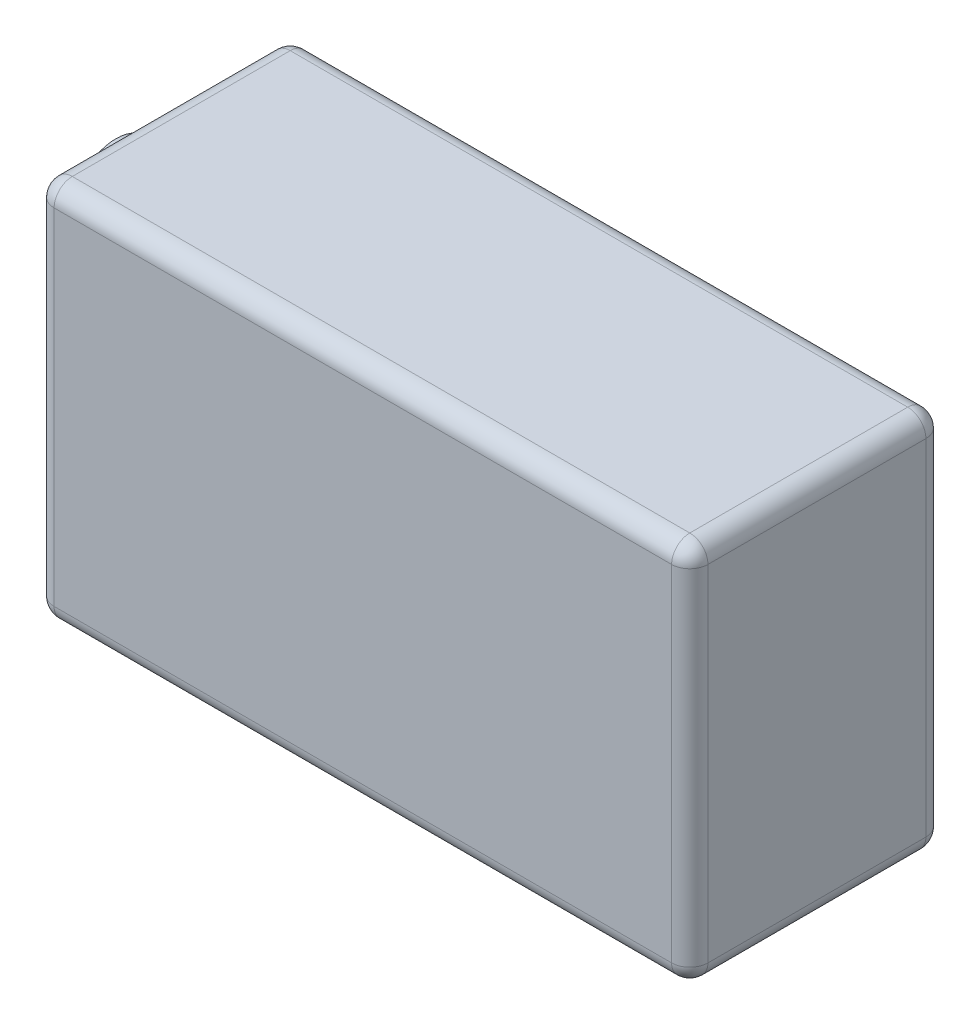
ISO-10303-21;
HEADER;
FILE_DESCRIPTION(('STEP AP214'),'2;1');
FILE_NAME('part.step','',(''),(''),'','','');
FILE_SCHEMA(('AUTOMOTIVE_DESIGN { 1 0 10303 214 1 1 1 1 }'));
ENDSEC;
DATA;
#1=APPLICATION_CONTEXT('core data for automotive mechanical design processes');
#2=APPLICATION_PROTOCOL_DEFINITION('international standard','automotive_design',2000,#1);
#3=PRODUCT_CONTEXT('',#1,'mechanical');
#4=PRODUCT('Part','Part','',(#3));
#5=PRODUCT_RELATED_PRODUCT_CATEGORY('part','',(#4));
#6=PRODUCT_DEFINITION_FORMATION('','',#4);
#7=PRODUCT_DEFINITION_CONTEXT('part definition',#1,'design');
#8=PRODUCT_DEFINITION('design','',#6,#7);
#9=PRODUCT_DEFINITION_SHAPE('','',#8);
#10=(LENGTH_UNIT() NAMED_UNIT(*) SI_UNIT(.MILLI.,.METRE.));
#11=(NAMED_UNIT(*) PLANE_ANGLE_UNIT() SI_UNIT($,.RADIAN.));
#12=(NAMED_UNIT(*) SI_UNIT($,.STERADIAN.) SOLID_ANGLE_UNIT());
#13=UNCERTAINTY_MEASURE_WITH_UNIT(LENGTH_MEASURE(1.E-05),#10,'distance_accuracy_value','');
#14=(GEOMETRIC_REPRESENTATION_CONTEXT(3) GLOBAL_UNCERTAINTY_ASSIGNED_CONTEXT((#13)) GLOBAL_UNIT_ASSIGNED_CONTEXT((#10,
#11,#12)) REPRESENTATION_CONTEXT('',''));
#15=CARTESIAN_POINT('',(0.,0.,0.));
#16=DIRECTION('',(0.,0.,1.));
#17=DIRECTION('',(1.,0.,0.));
#18=AXIS2_PLACEMENT_3D('',#15,#16,#17);
#19=CARTESIAN_POINT('',(22.86,13.335,17.78));
#20=DIRECTION('',(-1.,0.,0.));
#21=DIRECTION('',(0.,0.,1.));
#22=AXIS2_PLACEMENT_3D('',#19,#20,#21);
#23=PLANE('',#22);
#24=DIRECTION('',(0.,1.,0.));
#25=VECTOR('',#24,1.);
#26=CARTESIAN_POINT('',(22.86,13.335,1.27));
#27=LINE('',#26,#25);
#28=CARTESIAN_POINT('',(22.86,-12.065,1.27));
#29=VERTEX_POINT('',#28);
#30=CARTESIAN_POINT('',(22.86,12.065,1.27));
#31=VERTEX_POINT('',#30);
#32=EDGE_CURVE('E47',#29,#31,#27,.T.);
#33=ORIENTED_EDGE('',*,*,#32,.T.);
#34=DIRECTION('',(0.,0.,-1.));
#35=VECTOR('',#34,1.);
#36=CARTESIAN_POINT('',(22.86,12.065,17.78));
#37=LINE('',#36,#35);
#38=CARTESIAN_POINT('',(22.86,12.065,16.51));
#39=VERTEX_POINT('',#38);
#40=EDGE_CURVE('E205',#31,#39,#37,.F.);
#41=ORIENTED_EDGE('',*,*,#40,.T.);
#42=DIRECTION('',(0.,1.,0.));
#43=VECTOR('',#42,1.);
#44=CARTESIAN_POINT('',(22.86,-13.335,16.51));
#45=LINE('',#44,#43);
#46=CARTESIAN_POINT('',(22.86,-12.065,16.51));
#47=VERTEX_POINT('',#46);
#48=EDGE_CURVE('E137',#39,#47,#45,.F.);
#49=ORIENTED_EDGE('',*,*,#48,.T.);
#50=DIRECTION('',(0.,0.,-1.));
#51=VECTOR('',#50,1.);
#52=CARTESIAN_POINT('',(22.86,-12.065,17.78));
#53=LINE('',#52,#51);
#54=EDGE_CURVE('E52',#47,#29,#53,.T.);
#55=ORIENTED_EDGE('',*,*,#54,.T.);
#56=EDGE_LOOP('',(#33,#41,#49,#55));
#57=FACE_BOUND('',#56,.T.);
#58=ADVANCED_FACE('F32',(#57),#23,.F.);
#59=CARTESIAN_POINT('',(-22.86,13.335,17.78));
#60=DIRECTION('',(0.,-1.,0.));
#61=DIRECTION('',(0.,0.,-1.));
#62=AXIS2_PLACEMENT_3D('',#59,#60,#61);
#63=PLANE('',#62);
#64=DIRECTION('',(0.,0.,-1.));
#65=VECTOR('',#64,1.);
#66=CARTESIAN_POINT('',(21.59,13.335,17.78));
#67=LINE('',#66,#65);
#68=CARTESIAN_POINT('',(21.59,13.335,16.51));
#69=VERTEX_POINT('',#68);
#70=CARTESIAN_POINT('',(21.59,13.335,1.27));
#71=VERTEX_POINT('',#70);
#72=EDGE_CURVE('E195',#69,#71,#67,.T.);
#73=ORIENTED_EDGE('',*,*,#72,.T.);
#74=DIRECTION('',(-1.,0.,0.));
#75=VECTOR('',#74,1.);
#76=CARTESIAN_POINT('',(-22.86,13.335,1.27));
#77=LINE('',#76,#75);
#78=CARTESIAN_POINT('',(-21.59,13.335,1.27));
#79=VERTEX_POINT('',#78);
#80=EDGE_CURVE('E200',#71,#79,#77,.T.);
#81=ORIENTED_EDGE('',*,*,#80,.T.);
#82=DIRECTION('',(0.,0.,-1.));
#83=VECTOR('',#82,1.);
#84=CARTESIAN_POINT('',(-21.59,13.335,17.78));
#85=LINE('',#84,#83);
#86=CARTESIAN_POINT('',(-21.59,13.335,16.51));
#87=VERTEX_POINT('',#86);
#88=EDGE_CURVE('E197',#79,#87,#85,.F.);
#89=ORIENTED_EDGE('',*,*,#88,.T.);
#90=DIRECTION('',(-1.,0.,0.));
#91=VECTOR('',#90,1.);
#92=CARTESIAN_POINT('',(22.86,13.335,16.51));
#93=LINE('',#92,#91);
#94=EDGE_CURVE('E193',#87,#69,#93,.F.);
#95=ORIENTED_EDGE('',*,*,#94,.T.);
#96=EDGE_LOOP('',(#73,#81,#89,#95));
#97=FACE_BOUND('',#96,.T.);
#98=ADVANCED_FACE('F265',(#97),#63,.F.);
#99=CARTESIAN_POINT('',(-22.86,13.335,17.78));
#100=DIRECTION('',(1.,0.,0.));
#101=DIRECTION('',(0.,1.,0.));
#102=AXIS2_PLACEMENT_3D('',#99,#100,#101);
#103=PLANE('',#102);
#104=CARTESIAN_POINT('',(-22.86,-5.8801,8.89));
#105=DIRECTION('',(1.,0.,0.));
#106=DIRECTION('',(0.,1.,0.));
#107=AXIS2_PLACEMENT_3D('',#104,#105,#106);
#108=CIRCLE('',#107,4.0005);
#109=CARTESIAN_POINT('',(-22.86,-1.8796,8.89));
#110=VERTEX_POINT('',#109);
#111=EDGE_CURVE('E11',#110,#110,#108,.F.);
#112=ORIENTED_EDGE('',*,*,#111,.F.);
#113=EDGE_LOOP('',(#112));
#114=FACE_BOUND('',#113,.T.);
#115=CARTESIAN_POINT('',(-22.86,6.5405,8.89));
#116=DIRECTION('',(1.,0.,0.));
#117=DIRECTION('',(0.,1.,0.));
#118=AXIS2_PLACEMENT_3D('',#115,#116,#117);
#119=CIRCLE('',#118,2.9845);
#120=CARTESIAN_POINT('',(-22.86,9.525,8.89));
#121=VERTEX_POINT('',#120);
#122=EDGE_CURVE('E40',#121,#121,#119,.F.);
#123=ORIENTED_EDGE('',*,*,#122,.F.);
#124=EDGE_LOOP('',(#123));
#125=FACE_BOUND('',#124,.T.);
#126=DIRECTION('',(0.,0.,-1.));
#127=VECTOR('',#126,1.);
#128=CARTESIAN_POINT('',(-22.86,-12.065,17.78));
#129=LINE('',#128,#127);
#130=CARTESIAN_POINT('',(-22.86,-12.065,1.27));
#131=VERTEX_POINT('',#130);
#132=CARTESIAN_POINT('',(-22.86,-12.065,16.51));
#133=VERTEX_POINT('',#132);
#134=EDGE_CURVE('E170',#131,#133,#129,.F.);
#135=ORIENTED_EDGE('',*,*,#134,.T.);
#136=DIRECTION('',(0.,-1.,0.));
#137=VECTOR('',#136,1.);
#138=CARTESIAN_POINT('',(-22.86,13.335,16.51));
#139=LINE('',#138,#137);
#140=CARTESIAN_POINT('',(-22.86,12.065,16.51));
#141=VERTEX_POINT('',#140);
#142=EDGE_CURVE('E172',#133,#141,#139,.F.);
#143=ORIENTED_EDGE('',*,*,#142,.T.);
#144=DIRECTION('',(0.,0.,-1.));
#145=VECTOR('',#144,1.);
#146=CARTESIAN_POINT('',(-22.86,12.065,17.78));
#147=LINE('',#146,#145);
#148=CARTESIAN_POINT('',(-22.86,12.065,1.27));
#149=VERTEX_POINT('',#148);
#150=EDGE_CURVE('E166',#141,#149,#147,.T.);
#151=ORIENTED_EDGE('',*,*,#150,.T.);
#152=DIRECTION('',(0.,-1.,0.));
#153=VECTOR('',#152,1.);
#154=CARTESIAN_POINT('',(-22.86,13.335,1.27));
#155=LINE('',#154,#153);
#156=EDGE_CURVE('E168',#149,#131,#155,.T.);
#157=ORIENTED_EDGE('',*,*,#156,.T.);
#158=EDGE_LOOP('',(#135,#143,#151,#157));
#159=FACE_BOUND('',#158,.T.);
#160=ADVANCED_FACE('F261',(#114,#125,#159),#103,.F.);
#161=CARTESIAN_POINT('',(-22.86,-13.335,17.78));
#162=DIRECTION('',(0.,1.,0.));
#163=DIRECTION('',(0.,0.,1.));
#164=AXIS2_PLACEMENT_3D('',#161,#162,#163);
#165=PLANE('',#164);
#166=DIRECTION('',(0.,0.,-1.));
#167=VECTOR('',#166,1.);
#168=CARTESIAN_POINT('',(21.59,-13.335,17.78));
#169=LINE('',#168,#167);
#170=CARTESIAN_POINT('',(21.59,-13.335,1.27));
#171=VERTEX_POINT('',#170);
#172=CARTESIAN_POINT('',(21.59,-13.335,16.51));
#173=VERTEX_POINT('',#172);
#174=EDGE_CURVE('E177',#171,#173,#169,.F.);
#175=ORIENTED_EDGE('',*,*,#174,.T.);
#176=DIRECTION('',(1.,0.,0.));
#177=VECTOR('',#176,1.);
#178=CARTESIAN_POINT('',(-22.86,-13.335,16.51));
#179=LINE('',#178,#177);
#180=CARTESIAN_POINT('',(-21.59,-13.335,16.51));
#181=VERTEX_POINT('',#180);
#182=EDGE_CURVE('E182',#173,#181,#179,.F.);
#183=ORIENTED_EDGE('',*,*,#182,.T.);
#184=DIRECTION('',(0.,0.,-1.));
#185=VECTOR('',#184,1.);
#186=CARTESIAN_POINT('',(-21.59,-13.335,17.78));
#187=LINE('',#186,#185);
#188=CARTESIAN_POINT('',(-21.59,-13.335,1.27));
#189=VERTEX_POINT('',#188);
#190=EDGE_CURVE('E179',#181,#189,#187,.T.);
#191=ORIENTED_EDGE('',*,*,#190,.T.);
#192=DIRECTION('',(1.,0.,0.));
#193=VECTOR('',#192,1.);
#194=CARTESIAN_POINT('',(-22.86,-13.335,1.27));
#195=LINE('',#194,#193);
#196=EDGE_CURVE('E175',#189,#171,#195,.T.);
#197=ORIENTED_EDGE('',*,*,#196,.T.);
#198=EDGE_LOOP('',(#175,#183,#191,#197));
#199=FACE_BOUND('',#198,.T.);
#200=ADVANCED_FACE('F264',(#199),#165,.F.);
#201=CARTESIAN_POINT('',(0.,0.,17.78));
#202=DIRECTION('',(0.,0.,1.));
#203=DIRECTION('',(1.,0.,0.));
#204=AXIS2_PLACEMENT_3D('',#201,#202,#203);
#205=PLANE('',#204);
#206=DIRECTION('',(0.,-1.,0.));
#207=VECTOR('',#206,1.);
#208=CARTESIAN_POINT('',(-21.59,-13.335,17.78));
#209=LINE('',#208,#207);
#210=CARTESIAN_POINT('',(-21.59,12.065,17.78));
#211=VERTEX_POINT('',#210);
#212=CARTESIAN_POINT('',(-21.59,-12.065,17.78));
#213=VERTEX_POINT('',#212);
#214=EDGE_CURVE('E131',#211,#213,#209,.T.);
#215=ORIENTED_EDGE('',*,*,#214,.T.);
#216=DIRECTION('',(1.,0.,0.));
#217=VECTOR('',#216,1.);
#218=CARTESIAN_POINT('',(22.86,-12.065,17.78));
#219=LINE('',#218,#217);
#220=CARTESIAN_POINT('',(21.59,-12.065,17.78));
#221=VERTEX_POINT('',#220);
#222=EDGE_CURVE('E127',#213,#221,#219,.T.);
#223=ORIENTED_EDGE('',*,*,#222,.T.);
#224=DIRECTION('',(0.,1.,0.));
#225=VECTOR('',#224,1.);
#226=CARTESIAN_POINT('',(21.59,13.335,17.78));
#227=LINE('',#226,#225);
#228=CARTESIAN_POINT('',(21.59,12.065,17.78));
#229=VERTEX_POINT('',#228);
#230=EDGE_CURVE('E119',#221,#229,#227,.T.);
#231=ORIENTED_EDGE('',*,*,#230,.T.);
#232=DIRECTION('',(-1.,0.,0.));
#233=VECTOR('',#232,1.);
#234=CARTESIAN_POINT('',(-22.86,12.065,17.78));
#235=LINE('',#234,#233);
#236=EDGE_CURVE('E124',#229,#211,#235,.T.);
#237=ORIENTED_EDGE('',*,*,#236,.T.);
#238=EDGE_LOOP('',(#215,#223,#231,#237));
#239=FACE_BOUND('',#238,.T.);
#240=ADVANCED_FACE('F122',(#239),#205,.T.);
#241=CARTESIAN_POINT('',(0.,0.,0.));
#242=DIRECTION('',(0.,0.,1.));
#243=DIRECTION('',(1.,0.,0.));
#244=AXIS2_PLACEMENT_3D('',#241,#242,#243);
#245=PLANE('',#244);
#246=DIRECTION('',(0.,1.,0.));
#247=VECTOR('',#246,1.);
#248=CARTESIAN_POINT('',(21.59,0.,0.));
#249=LINE('',#248,#247);
#250=CARTESIAN_POINT('',(21.59,12.065,0.));
#251=VERTEX_POINT('',#250);
#252=CARTESIAN_POINT('',(21.59,-12.065,0.));
#253=VERTEX_POINT('',#252);
#254=EDGE_CURVE('E186',#251,#253,#249,.F.);
#255=ORIENTED_EDGE('',*,*,#254,.T.);
#256=DIRECTION('',(1.,0.,0.));
#257=VECTOR('',#256,1.);
#258=CARTESIAN_POINT('',(0.,-12.065,0.));
#259=LINE('',#258,#257);
#260=CARTESIAN_POINT('',(-21.59,-12.065,0.));
#261=VERTEX_POINT('',#260);
#262=EDGE_CURVE('E191',#253,#261,#259,.F.);
#263=ORIENTED_EDGE('',*,*,#262,.T.);
#264=DIRECTION('',(0.,-1.,0.));
#265=VECTOR('',#264,1.);
#266=CARTESIAN_POINT('',(-21.59,0.,0.));
#267=LINE('',#266,#265);
#268=CARTESIAN_POINT('',(-21.59,12.065,0.));
#269=VERTEX_POINT('',#268);
#270=EDGE_CURVE('E188',#261,#269,#267,.F.);
#271=ORIENTED_EDGE('',*,*,#270,.T.);
#272=DIRECTION('',(-1.,0.,0.));
#273=VECTOR('',#272,1.);
#274=CARTESIAN_POINT('',(0.,12.065,0.));
#275=LINE('',#274,#273);
#276=EDGE_CURVE('E184',#269,#251,#275,.F.);
#277=ORIENTED_EDGE('',*,*,#276,.T.);
#278=EDGE_LOOP('',(#255,#263,#271,#277));
#279=FACE_BOUND('',#278,.T.);
#280=ADVANCED_FACE('F371',(#279),#245,.F.);
#281=CARTESIAN_POINT('',(21.59,13.335,1.27));
#282=DIRECTION('',(0.,1.,0.));
#283=DIRECTION('',(0.,0.,1.));
#284=AXIS2_PLACEMENT_3D('',#281,#282,#283);
#285=CYLINDRICAL_SURFACE('',#284,1.27);
#286=CARTESIAN_POINT('',(21.59,12.065,1.27));
#287=DIRECTION('',(0.,1.,0.));
#288=DIRECTION('',(0.,0.,1.));
#289=AXIS2_PLACEMENT_3D('',#286,#287,#288);
#290=CIRCLE('',#289,1.27);
#291=EDGE_CURVE('E155',#31,#251,#290,.T.);
#292=ORIENTED_EDGE('',*,*,#291,.F.);
#293=ORIENTED_EDGE('',*,*,#32,.F.);
#294=CARTESIAN_POINT('',(21.59,-12.065,1.27));
#295=DIRECTION('',(0.,-1.,0.));
#296=DIRECTION('',(0.,0.,-1.));
#297=AXIS2_PLACEMENT_3D('',#294,#295,#296);
#298=CIRCLE('',#297,1.27);
#299=EDGE_CURVE('E158',#253,#29,#298,.T.);
#300=ORIENTED_EDGE('',*,*,#299,.F.);
#301=ORIENTED_EDGE('',*,*,#254,.F.);
#302=EDGE_LOOP('',(#292,#293,#300,#301));
#303=FACE_BOUND('',#302,.T.);
#304=ADVANCED_FACE('F34',(#303),#285,.T.);
#305=CARTESIAN_POINT('',(21.59,12.065,1.27));
#306=DIRECTION('',(0.,0.,1.));
#307=DIRECTION('',(1.,0.,0.));
#308=AXIS2_PLACEMENT_3D('',#305,#306,#307);
#309=SPHERICAL_SURFACE('',#308,1.27);
#310=CARTESIAN_POINT('',(21.59,12.065,1.27));
#311=DIRECTION('',(0.,0.,-1.));
#312=DIRECTION('',(-1.,0.,0.));
#313=AXIS2_PLACEMENT_3D('',#310,#311,#312);
#314=CIRCLE('',#313,1.27);
#315=EDGE_CURVE('E249',#31,#71,#314,.F.);
#316=ORIENTED_EDGE('',*,*,#315,.F.);
#317=ORIENTED_EDGE('',*,*,#291,.T.);
#318=CARTESIAN_POINT('',(21.59,12.065,1.27));
#319=DIRECTION('',(1.,0.,0.));
#320=DIRECTION('',(0.,0.,-1.));
#321=AXIS2_PLACEMENT_3D('',#318,#319,#320);
#322=CIRCLE('',#321,1.27);
#323=EDGE_CURVE('E252',#71,#251,#322,.F.);
#324=ORIENTED_EDGE('',*,*,#323,.F.);
#325=EDGE_LOOP('',(#316,#317,#324));
#326=FACE_BOUND('',#325,.T.);
#327=ADVANCED_FACE('F305',(#326),#309,.T.);
#328=CARTESIAN_POINT('',(21.59,-12.065,1.27));
#329=DIRECTION('',(0.,0.,1.));
#330=DIRECTION('',(1.,0.,0.));
#331=AXIS2_PLACEMENT_3D('',#328,#329,#330);
#332=SPHERICAL_SURFACE('',#331,1.27);
#333=CARTESIAN_POINT('',(21.59,-12.065,1.27));
#334=DIRECTION('',(1.,0.,0.));
#335=DIRECTION('',(0.,0.,-1.));
#336=AXIS2_PLACEMENT_3D('',#333,#334,#335);
#337=CIRCLE('',#336,1.27);
#338=EDGE_CURVE('E243',#253,#171,#337,.F.);
#339=ORIENTED_EDGE('',*,*,#338,.F.);
#340=ORIENTED_EDGE('',*,*,#299,.T.);
#341=CARTESIAN_POINT('',(21.59,-12.065,1.27));
#342=DIRECTION('',(0.,0.,-1.));
#343=DIRECTION('',(-1.,0.,0.));
#344=AXIS2_PLACEMENT_3D('',#341,#342,#343);
#345=CIRCLE('',#344,1.27);
#346=EDGE_CURVE('E246',#171,#29,#345,.F.);
#347=ORIENTED_EDGE('',*,*,#346,.F.);
#348=EDGE_LOOP('',(#339,#340,#347));
#349=FACE_BOUND('',#348,.T.);
#350=ADVANCED_FACE('F296',(#349),#332,.T.);
#351=CARTESIAN_POINT('',(-22.86,12.065,1.27));
#352=DIRECTION('',(-1.,0.,0.));
#353=DIRECTION('',(0.,0.,1.));
#354=AXIS2_PLACEMENT_3D('',#351,#352,#353);
#355=CYLINDRICAL_SURFACE('',#354,1.27);
#356=ORIENTED_EDGE('',*,*,#323,.T.);
#357=ORIENTED_EDGE('',*,*,#276,.F.);
#358=CARTESIAN_POINT('',(-21.59,12.065,1.27));
#359=DIRECTION('',(-1.,0.,0.));
#360=DIRECTION('',(0.,0.,1.));
#361=AXIS2_PLACEMENT_3D('',#358,#359,#360);
#362=CIRCLE('',#361,1.27);
#363=EDGE_CURVE('E238',#79,#269,#362,.T.);
#364=ORIENTED_EDGE('',*,*,#363,.F.);
#365=ORIENTED_EDGE('',*,*,#80,.F.);
#366=EDGE_LOOP('',(#356,#357,#364,#365));
#367=FACE_BOUND('',#366,.T.);
#368=ADVANCED_FACE('F362',(#367),#355,.T.);
#369=CARTESIAN_POINT('',(21.59,12.065,17.78));
#370=DIRECTION('',(0.,0.,-1.));
#371=DIRECTION('',(-1.,0.,0.));
#372=AXIS2_PLACEMENT_3D('',#369,#370,#371);
#373=CYLINDRICAL_SURFACE('',#372,1.27);
#374=ORIENTED_EDGE('',*,*,#315,.T.);
#375=ORIENTED_EDGE('',*,*,#72,.F.);
#376=CARTESIAN_POINT('',(21.59,12.065,16.51));
#377=DIRECTION('',(0.,0.,1.));
#378=DIRECTION('',(1.,0.,0.));
#379=AXIS2_PLACEMENT_3D('',#376,#377,#378);
#380=CIRCLE('',#379,1.27);
#381=EDGE_CURVE('E141',#39,#69,#380,.T.);
#382=ORIENTED_EDGE('',*,*,#381,.F.);
#383=ORIENTED_EDGE('',*,*,#40,.F.);
#384=EDGE_LOOP('',(#374,#375,#382,#383));
#385=FACE_BOUND('',#384,.T.);
#386=ADVANCED_FACE('F309',(#385),#373,.T.);
#387=CARTESIAN_POINT('',(21.59,0.,16.51));
#388=DIRECTION('',(0.,-1.,0.));
#389=DIRECTION('',(0.,0.,-1.));
#390=AXIS2_PLACEMENT_3D('',#387,#388,#389);
#391=CYLINDRICAL_SURFACE('',#390,1.27);
#392=CARTESIAN_POINT('',(21.59,-12.065,16.51));
#393=DIRECTION('',(0.,-1.,0.));
#394=DIRECTION('',(0.,0.,-1.));
#395=AXIS2_PLACEMENT_3D('',#392,#393,#394);
#396=CIRCLE('',#395,1.27);
#397=EDGE_CURVE('E142',#47,#221,#396,.T.);
#398=ORIENTED_EDGE('',*,*,#397,.F.);
#399=ORIENTED_EDGE('',*,*,#48,.F.);
#400=CARTESIAN_POINT('',(21.59,12.065,16.51));
#401=DIRECTION('',(0.,1.,0.));
#402=DIRECTION('',(0.,0.,1.));
#403=AXIS2_PLACEMENT_3D('',#400,#401,#402);
#404=CIRCLE('',#403,1.27);
#405=EDGE_CURVE('E134',#229,#39,#404,.T.);
#406=ORIENTED_EDGE('',*,*,#405,.F.);
#407=ORIENTED_EDGE('',*,*,#230,.F.);
#408=EDGE_LOOP('',(#398,#399,#406,#407));
#409=FACE_BOUND('',#408,.T.);
#410=ADVANCED_FACE('F136',(#409),#391,.T.);
#411=CARTESIAN_POINT('',(21.59,-12.065,17.78));
#412=DIRECTION('',(0.,0.,-1.));
#413=DIRECTION('',(-1.,0.,0.));
#414=AXIS2_PLACEMENT_3D('',#411,#412,#413);
#415=CYLINDRICAL_SURFACE('',#414,1.27);
#416=ORIENTED_EDGE('',*,*,#346,.T.);
#417=ORIENTED_EDGE('',*,*,#54,.F.);
#418=CARTESIAN_POINT('',(21.59,-12.065,16.51));
#419=DIRECTION('',(0.,0.,1.));
#420=DIRECTION('',(1.,0.,0.));
#421=AXIS2_PLACEMENT_3D('',#418,#419,#420);
#422=CIRCLE('',#421,1.27);
#423=EDGE_CURVE('E233',#173,#47,#422,.T.);
#424=ORIENTED_EDGE('',*,*,#423,.F.);
#425=ORIENTED_EDGE('',*,*,#174,.F.);
#426=EDGE_LOOP('',(#416,#417,#424,#425));
#427=FACE_BOUND('',#426,.T.);
#428=ADVANCED_FACE('F292',(#427),#415,.T.);
#429=CARTESIAN_POINT('',(-22.86,-12.065,1.27));
#430=DIRECTION('',(1.,0.,0.));
#431=DIRECTION('',(0.,0.,-1.));
#432=AXIS2_PLACEMENT_3D('',#429,#430,#431);
#433=CYLINDRICAL_SURFACE('',#432,1.27);
#434=ORIENTED_EDGE('',*,*,#338,.T.);
#435=ORIENTED_EDGE('',*,*,#196,.F.);
#436=CARTESIAN_POINT('',(-21.59,-12.065,1.27));
#437=DIRECTION('',(-1.,0.,0.));
#438=DIRECTION('',(0.,0.,1.));
#439=AXIS2_PLACEMENT_3D('',#436,#437,#438);
#440=CIRCLE('',#439,1.27);
#441=EDGE_CURVE('E230',#261,#189,#440,.T.);
#442=ORIENTED_EDGE('',*,*,#441,.F.);
#443=ORIENTED_EDGE('',*,*,#262,.F.);
#444=EDGE_LOOP('',(#434,#435,#442,#443));
#445=FACE_BOUND('',#444,.T.);
#446=ADVANCED_FACE('F351',(#445),#433,.T.);
#447=CARTESIAN_POINT('',(-21.59,13.335,1.27));
#448=DIRECTION('',(0.,-1.,0.));
#449=DIRECTION('',(1.,0.,0.));
#450=AXIS2_PLACEMENT_3D('',#447,#448,#449);
#451=CYLINDRICAL_SURFACE('',#450,1.27);
#452=CARTESIAN_POINT('',(-21.59,12.065,1.27));
#453=DIRECTION('',(0.,1.,0.));
#454=DIRECTION('',(0.,0.,1.));
#455=AXIS2_PLACEMENT_3D('',#452,#453,#454);
#456=CIRCLE('',#455,1.27);
#457=EDGE_CURVE('E240',#269,#149,#456,.T.);
#458=ORIENTED_EDGE('',*,*,#457,.F.);
#459=ORIENTED_EDGE('',*,*,#270,.F.);
#460=CARTESIAN_POINT('',(-21.59,-12.065,1.27));
#461=DIRECTION('',(0.,-1.,0.));
#462=DIRECTION('',(0.,0.,-1.));
#463=AXIS2_PLACEMENT_3D('',#460,#461,#462);
#464=CIRCLE('',#463,1.27);
#465=EDGE_CURVE('E227',#131,#261,#464,.T.);
#466=ORIENTED_EDGE('',*,*,#465,.F.);
#467=ORIENTED_EDGE('',*,*,#156,.F.);
#468=EDGE_LOOP('',(#458,#459,#466,#467));
#469=FACE_BOUND('',#468,.T.);
#470=ADVANCED_FACE('F347',(#469),#451,.T.);
#471=CARTESIAN_POINT('',(-21.59,12.065,1.27));
#472=DIRECTION('',(0.,0.,1.));
#473=DIRECTION('',(1.,0.,0.));
#474=AXIS2_PLACEMENT_3D('',#471,#472,#473);
#475=SPHERICAL_SURFACE('',#474,1.27);
#476=ORIENTED_EDGE('',*,*,#363,.T.);
#477=ORIENTED_EDGE('',*,*,#457,.T.);
#478=CARTESIAN_POINT('',(-21.59,12.065,1.27));
#479=DIRECTION('',(0.,0.,-1.));
#480=DIRECTION('',(-1.,0.,0.));
#481=AXIS2_PLACEMENT_3D('',#478,#479,#480);
#482=CIRCLE('',#481,1.27);
#483=EDGE_CURVE('E149',#79,#149,#482,.F.);
#484=ORIENTED_EDGE('',*,*,#483,.F.);
#485=EDGE_LOOP('',(#476,#477,#484));
#486=FACE_BOUND('',#485,.T.);
#487=ADVANCED_FACE('F344',(#486),#475,.T.);
#488=CARTESIAN_POINT('',(21.59,12.065,16.51));
#489=DIRECTION('',(0.,0.,1.));
#490=DIRECTION('',(1.,0.,0.));
#491=AXIS2_PLACEMENT_3D('',#488,#489,#490);
#492=SPHERICAL_SURFACE('',#491,1.27);
#493=ORIENTED_EDGE('',*,*,#405,.T.);
#494=ORIENTED_EDGE('',*,*,#381,.T.);
#495=CARTESIAN_POINT('',(21.59,12.065,16.51));
#496=DIRECTION('',(1.,0.,0.));
#497=DIRECTION('',(0.,0.,-1.));
#498=AXIS2_PLACEMENT_3D('',#495,#496,#497);
#499=CIRCLE('',#498,1.27);
#500=EDGE_CURVE('E145',#229,#69,#499,.F.);
#501=ORIENTED_EDGE('',*,*,#500,.F.);
#502=EDGE_LOOP('',(#493,#494,#501));
#503=FACE_BOUND('',#502,.T.);
#504=ADVANCED_FACE('F146',(#503),#492,.T.);
#505=CARTESIAN_POINT('',(21.59,-12.065,16.51));
#506=DIRECTION('',(0.,0.,1.));
#507=DIRECTION('',(1.,0.,0.));
#508=AXIS2_PLACEMENT_3D('',#505,#506,#507);
#509=SPHERICAL_SURFACE('',#508,1.27);
#510=ORIENTED_EDGE('',*,*,#423,.T.);
#511=ORIENTED_EDGE('',*,*,#397,.T.);
#512=CARTESIAN_POINT('',(21.59,-12.065,16.51));
#513=DIRECTION('',(1.,0.,0.));
#514=DIRECTION('',(0.,0.,-1.));
#515=AXIS2_PLACEMENT_3D('',#512,#513,#514);
#516=CIRCLE('',#515,1.27);
#517=EDGE_CURVE('E150',#173,#221,#516,.F.);
#518=ORIENTED_EDGE('',*,*,#517,.F.);
#519=EDGE_LOOP('',(#510,#511,#518));
#520=FACE_BOUND('',#519,.T.);
#521=ADVANCED_FACE('F288',(#520),#509,.T.);
#522=CARTESIAN_POINT('',(-21.59,-12.065,1.27));
#523=DIRECTION('',(0.,0.,1.));
#524=DIRECTION('',(1.,0.,0.));
#525=AXIS2_PLACEMENT_3D('',#522,#523,#524);
#526=SPHERICAL_SURFACE('',#525,1.27);
#527=ORIENTED_EDGE('',*,*,#465,.T.);
#528=ORIENTED_EDGE('',*,*,#441,.T.);
#529=CARTESIAN_POINT('',(-21.59,-12.065,1.27));
#530=DIRECTION('',(0.,0.,-1.));
#531=DIRECTION('',(-1.,0.,0.));
#532=AXIS2_PLACEMENT_3D('',#529,#530,#531);
#533=CIRCLE('',#532,1.27);
#534=EDGE_CURVE('E221',#131,#189,#533,.F.);
#535=ORIENTED_EDGE('',*,*,#534,.F.);
#536=EDGE_LOOP('',(#527,#528,#535));
#537=FACE_BOUND('',#536,.T.);
#538=ADVANCED_FACE('F335',(#537),#526,.T.);
#539=CARTESIAN_POINT('',(-21.59,12.065,17.78));
#540=DIRECTION('',(0.,0.,-1.));
#541=DIRECTION('',(-1.,0.,0.));
#542=AXIS2_PLACEMENT_3D('',#539,#540,#541);
#543=CYLINDRICAL_SURFACE('',#542,1.27);
#544=ORIENTED_EDGE('',*,*,#483,.T.);
#545=ORIENTED_EDGE('',*,*,#150,.F.);
#546=CARTESIAN_POINT('',(-21.59,12.065,16.51));
#547=DIRECTION('',(0.,0.,1.));
#548=DIRECTION('',(1.,0.,0.));
#549=AXIS2_PLACEMENT_3D('',#546,#547,#548);
#550=CIRCLE('',#549,1.27);
#551=EDGE_CURVE('E218',#87,#141,#550,.T.);
#552=ORIENTED_EDGE('',*,*,#551,.F.);
#553=ORIENTED_EDGE('',*,*,#88,.F.);
#554=EDGE_LOOP('',(#544,#545,#552,#553));
#555=FACE_BOUND('',#554,.T.);
#556=ADVANCED_FACE('F332',(#555),#543,.T.);
#557=CARTESIAN_POINT('',(0.,12.065,16.51));
#558=DIRECTION('',(1.,0.,0.));
#559=DIRECTION('',(0.,0.,-1.));
#560=AXIS2_PLACEMENT_3D('',#557,#558,#559);
#561=CYLINDRICAL_SURFACE('',#560,1.27);
#562=ORIENTED_EDGE('',*,*,#500,.T.);
#563=ORIENTED_EDGE('',*,*,#94,.F.);
#564=CARTESIAN_POINT('',(-21.59,12.065,16.51));
#565=DIRECTION('',(-1.,0.,0.));
#566=DIRECTION('',(0.,0.,1.));
#567=AXIS2_PLACEMENT_3D('',#564,#565,#566);
#568=CIRCLE('',#567,1.27);
#569=EDGE_CURVE('E153',#211,#87,#568,.T.);
#570=ORIENTED_EDGE('',*,*,#569,.F.);
#571=ORIENTED_EDGE('',*,*,#236,.F.);
#572=EDGE_LOOP('',(#562,#563,#570,#571));
#573=FACE_BOUND('',#572,.T.);
#574=ADVANCED_FACE('F152',(#573),#561,.T.);
#575=CARTESIAN_POINT('',(0.,-12.065,16.51));
#576=DIRECTION('',(-1.,0.,0.));
#577=DIRECTION('',(0.,0.,1.));
#578=AXIS2_PLACEMENT_3D('',#575,#576,#577);
#579=CYLINDRICAL_SURFACE('',#578,1.27);
#580=ORIENTED_EDGE('',*,*,#517,.T.);
#581=ORIENTED_EDGE('',*,*,#222,.F.);
#582=CARTESIAN_POINT('',(-21.59,-12.065,16.51));
#583=DIRECTION('',(-1.,0.,0.));
#584=DIRECTION('',(0.,0.,1.));
#585=AXIS2_PLACEMENT_3D('',#582,#583,#584);
#586=CIRCLE('',#585,1.27);
#587=EDGE_CURVE('E214',#181,#213,#586,.T.);
#588=ORIENTED_EDGE('',*,*,#587,.F.);
#589=ORIENTED_EDGE('',*,*,#182,.F.);
#590=EDGE_LOOP('',(#580,#581,#588,#589));
#591=FACE_BOUND('',#590,.T.);
#592=ADVANCED_FACE('F285',(#591),#579,.T.);
#593=CARTESIAN_POINT('',(-21.59,-12.065,17.78));
#594=DIRECTION('',(0.,0.,-1.));
#595=DIRECTION('',(-1.,0.,0.));
#596=AXIS2_PLACEMENT_3D('',#593,#594,#595);
#597=CYLINDRICAL_SURFACE('',#596,1.27);
#598=ORIENTED_EDGE('',*,*,#534,.T.);
#599=ORIENTED_EDGE('',*,*,#190,.F.);
#600=CARTESIAN_POINT('',(-21.59,-12.065,16.51));
#601=DIRECTION('',(0.,0.,1.));
#602=DIRECTION('',(1.,0.,0.));
#603=AXIS2_PLACEMENT_3D('',#600,#601,#602);
#604=CIRCLE('',#603,1.27);
#605=EDGE_CURVE('E211',#133,#181,#604,.T.);
#606=ORIENTED_EDGE('',*,*,#605,.F.);
#607=ORIENTED_EDGE('',*,*,#134,.F.);
#608=EDGE_LOOP('',(#598,#599,#606,#607));
#609=FACE_BOUND('',#608,.T.);
#610=ADVANCED_FACE('F275',(#609),#597,.T.);
#611=CARTESIAN_POINT('',(-21.59,12.065,16.51));
#612=DIRECTION('',(0.,0.,1.));
#613=DIRECTION('',(1.,0.,0.));
#614=AXIS2_PLACEMENT_3D('',#611,#612,#613);
#615=SPHERICAL_SURFACE('',#614,1.27);
#616=ORIENTED_EDGE('',*,*,#569,.T.);
#617=ORIENTED_EDGE('',*,*,#551,.T.);
#618=CARTESIAN_POINT('',(-21.59,12.065,16.51));
#619=DIRECTION('',(0.,1.,0.));
#620=DIRECTION('',(0.,0.,1.));
#621=AXIS2_PLACEMENT_3D('',#618,#619,#620);
#622=CIRCLE('',#621,1.27);
#623=EDGE_CURVE('E209',#211,#141,#622,.F.);
#624=ORIENTED_EDGE('',*,*,#623,.F.);
#625=EDGE_LOOP('',(#616,#617,#624));
#626=FACE_BOUND('',#625,.T.);
#627=ADVANCED_FACE('F322',(#626),#615,.T.);
#628=CARTESIAN_POINT('',(-21.59,-12.065,16.51));
#629=DIRECTION('',(0.,0.,1.));
#630=DIRECTION('',(1.,0.,0.));
#631=AXIS2_PLACEMENT_3D('',#628,#629,#630);
#632=SPHERICAL_SURFACE('',#631,1.27);
#633=ORIENTED_EDGE('',*,*,#605,.T.);
#634=ORIENTED_EDGE('',*,*,#587,.T.);
#635=CARTESIAN_POINT('',(-21.59,-12.065,16.51));
#636=DIRECTION('',(0.,-1.,0.));
#637=DIRECTION('',(0.,0.,-1.));
#638=AXIS2_PLACEMENT_3D('',#635,#636,#637);
#639=CIRCLE('',#638,1.27);
#640=EDGE_CURVE('E207',#133,#213,#639,.F.);
#641=ORIENTED_EDGE('',*,*,#640,.F.);
#642=EDGE_LOOP('',(#633,#634,#641));
#643=FACE_BOUND('',#642,.T.);
#644=ADVANCED_FACE('F282',(#643),#632,.T.);
#645=CARTESIAN_POINT('',(-21.59,0.,16.51));
#646=DIRECTION('',(0.,1.,0.));
#647=DIRECTION('',(-1.,0.,0.));
#648=AXIS2_PLACEMENT_3D('',#645,#646,#647);
#649=CYLINDRICAL_SURFACE('',#648,1.27);
#650=ORIENTED_EDGE('',*,*,#623,.T.);
#651=ORIENTED_EDGE('',*,*,#142,.F.);
#652=ORIENTED_EDGE('',*,*,#640,.T.);
#653=ORIENTED_EDGE('',*,*,#214,.F.);
#654=EDGE_LOOP('',(#650,#651,#652,#653));
#655=FACE_BOUND('',#654,.T.);
#656=ADVANCED_FACE('F280',(#655),#649,.T.);
#657=CARTESIAN_POINT('',(-26.162,6.5405,8.89));
#658=DIRECTION('',(1.,0.,0.));
#659=DIRECTION('',(0.,1.,0.));
#660=AXIS2_PLACEMENT_3D('',#657,#658,#659);
#661=CYLINDRICAL_SURFACE('',#660,2.9845);
#662=CARTESIAN_POINT('',(-26.162,6.5405,8.89));
#663=DIRECTION('',(-1.,0.,0.));
#664=DIRECTION('',(0.,-1.,0.));
#665=AXIS2_PLACEMENT_3D('',#662,#663,#664);
#666=CIRCLE('',#665,2.9845);
#667=CARTESIAN_POINT('',(-26.162,9.525,8.89));
#668=VERTEX_POINT('',#667);
#669=EDGE_CURVE('E161',#668,#668,#666,.T.);
#670=CARTESIAN_POINT('',(-26.162,9.525,8.89));
#671=CARTESIAN_POINT('',(-26.1276041666667,9.525,8.89));
#672=CARTESIAN_POINT('',(-26.0932083333333,9.525,8.89));
#673=CARTESIAN_POINT('',(-26.0244166666667,9.525,8.89));
#674=CARTESIAN_POINT('',(-25.9900208333333,9.525,8.89));
#675=CARTESIAN_POINT('',(-25.9212291666667,9.525,8.89));
#676=CARTESIAN_POINT('',(-25.8868333333333,9.525,8.89));
#677=CARTESIAN_POINT('',(-25.8180416666667,9.525,8.89));
#678=CARTESIAN_POINT('',(-25.7836458333333,9.525,8.89));
#679=CARTESIAN_POINT('',(-25.7148541666667,9.525,8.89));
#680=CARTESIAN_POINT('',(-25.6804583333333,9.525,8.89));
#681=CARTESIAN_POINT('',(-25.6116666666667,9.525,8.89));
#682=CARTESIAN_POINT('',(-25.5772708333333,9.525,8.89));
#683=CARTESIAN_POINT('',(-25.5084791666667,9.525,8.89));
#684=CARTESIAN_POINT('',(-25.4740833333333,9.525,8.89));
#685=CARTESIAN_POINT('',(-25.4052916666667,9.525,8.89));
#686=CARTESIAN_POINT('',(-25.3708958333333,9.525,8.89));
#687=CARTESIAN_POINT('',(-25.3021041666667,9.525,8.89));
#688=CARTESIAN_POINT('',(-25.2677083333333,9.525,8.89));
#689=CARTESIAN_POINT('',(-25.1989166666667,9.525,8.89));
#690=CARTESIAN_POINT('',(-25.1645208333333,9.525,8.89));
#691=CARTESIAN_POINT('',(-25.0957291666667,9.525,8.89));
#692=CARTESIAN_POINT('',(-25.0613333333333,9.525,8.89));
#693=CARTESIAN_POINT('',(-24.9925416666667,9.525,8.89));
#694=CARTESIAN_POINT('',(-24.9581458333333,9.525,8.89));
#695=CARTESIAN_POINT('',(-24.8893541666667,9.525,8.89));
#696=CARTESIAN_POINT('',(-24.8549583333333,9.525,8.89));
#697=CARTESIAN_POINT('',(-24.7861666666667,9.525,8.89));
#698=CARTESIAN_POINT('',(-24.7517708333333,9.525,8.89));
#699=CARTESIAN_POINT('',(-24.6829791666667,9.525,8.89));
#700=CARTESIAN_POINT('',(-24.6485833333333,9.525,8.89));
#701=CARTESIAN_POINT('',(-24.5797916666667,9.525,8.89));
#702=CARTESIAN_POINT('',(-24.5453958333333,9.525,8.89));
#703=CARTESIAN_POINT('',(-24.4766041666667,9.525,8.89));
#704=CARTESIAN_POINT('',(-24.4422083333333,9.525,8.89));
#705=CARTESIAN_POINT('',(-24.3734166666667,9.525,8.89));
#706=CARTESIAN_POINT('',(-24.3390208333333,9.525,8.89));
#707=CARTESIAN_POINT('',(-24.2702291666667,9.525,8.89));
#708=CARTESIAN_POINT('',(-24.2358333333333,9.525,8.89));
#709=CARTESIAN_POINT('',(-24.1670416666667,9.525,8.89));
#710=CARTESIAN_POINT('',(-24.1326458333333,9.525,8.89));
#711=CARTESIAN_POINT('',(-24.0638541666667,9.525,8.89));
#712=CARTESIAN_POINT('',(-24.0294583333333,9.525,8.89));
#713=CARTESIAN_POINT('',(-23.9606666666667,9.525,8.89));
#714=CARTESIAN_POINT('',(-23.9262708333333,9.525,8.89));
#715=CARTESIAN_POINT('',(-23.8574791666667,9.525,8.89));
#716=CARTESIAN_POINT('',(-23.8230833333333,9.525,8.89));
#717=CARTESIAN_POINT('',(-23.7542916666667,9.525,8.89));
#718=CARTESIAN_POINT('',(-23.7198958333333,9.525,8.89));
#719=CARTESIAN_POINT('',(-23.6511041666667,9.525,8.89));
#720=CARTESIAN_POINT('',(-23.6167083333333,9.525,8.89));
#721=CARTESIAN_POINT('',(-23.5479166666667,9.525,8.89));
#722=CARTESIAN_POINT('',(-23.5135208333333,9.525,8.89));
#723=CARTESIAN_POINT('',(-23.4447291666667,9.525,8.89));
#724=CARTESIAN_POINT('',(-23.4103333333333,9.525,8.89));
#725=CARTESIAN_POINT('',(-23.3415416666667,9.525,8.89));
#726=CARTESIAN_POINT('',(-23.3071458333333,9.525,8.89));
#727=CARTESIAN_POINT('',(-23.2383541666667,9.525,8.89));
#728=CARTESIAN_POINT('',(-23.2039583333333,9.525,8.89));
#729=CARTESIAN_POINT('',(-23.1351666666667,9.525,8.89));
#730=CARTESIAN_POINT('',(-23.1007708333333,9.525,8.89));
#731=CARTESIAN_POINT('',(-23.0319791666667,9.525,8.89));
#732=CARTESIAN_POINT('',(-22.9975833333333,9.525,8.89));
#733=CARTESIAN_POINT('',(-22.9287916666667,9.525,8.89));
#734=CARTESIAN_POINT('',(-22.8943958333333,9.525,8.89));
#735=CARTESIAN_POINT('',(-22.86,9.525,8.89));
#736=B_SPLINE_CURVE_WITH_KNOTS('',3,(#670,#671,#672,#673,#674,#675,#676,#677,#678,#679,#680,
#681,#682,#683,#684,#685,#686,#687,#688,#689,#690,#691,#692,#693,#694,#695,#696,#697,#698,#699,
#700,#701,#702,#703,#704,#705,#706,#707,#708,#709,#710,#711,#712,#713,#714,#715,#716,#717,#718,
#719,#720,#721,#722,#723,#724,#725,#726,#727,#728,#729,#730,#731,#732,#733,#734,#735),
.UNSPECIFIED.,.F.,.F.,(4,2,2,2,2,2,2,2,2,2,2,2,2,2,2,2,2,2,2,2,2,2,2,2,2,2,2,2,2,2,2,2,4),(0.,
0.103187499999997,0.206374999999998,0.309562499999999,0.412749999999996,0.515937499999997,
0.619124999999998,0.722312499999999,0.825499999999996,0.928687499999997,1.031875,1.1350625,
1.23825,1.3414375,1.444625,1.5478125,1.651,1.7541875,1.857375,1.9605625,2.06375,2.1669375,
2.270125,2.3733125,2.4765,2.5796875,2.682875,2.7860625,2.88925,2.9924375,3.095625,3.1988125,
3.302),.UNSPECIFIED.);
#737=EDGE_CURVE('BSEAM259',#668,#121,#736,.T.);
#738=ORIENTED_EDGE('',*,*,#669,.F.);
#739=ORIENTED_EDGE('',*,*,#122,.T.);
#740=ORIENTED_EDGE('',*,*,#737,.T.);
#741=ORIENTED_EDGE('',*,*,#737,.F.);
#742=EDGE_LOOP('',(#738,#740,#739,#741));
#743=FACE_BOUND('',#742,.T.);
#744=ADVANCED_FACE('F259',(#743),#661,.T.);
#745=CARTESIAN_POINT('',(-26.162,6.5405,8.89));
#746=DIRECTION('',(-1.,0.,0.));
#747=DIRECTION('',(0.,-1.,0.));
#748=AXIS2_PLACEMENT_3D('',#745,#746,#747);
#749=PLANE('',#748);
#750=ORIENTED_EDGE('',*,*,#669,.T.);
#751=EDGE_LOOP('',(#750));
#752=FACE_BOUND('',#751,.T.);
#753=ADVANCED_FACE('F539',(#752),#749,.T.);
#754=CARTESIAN_POINT('',(-26.162,-5.8801,8.89));
#755=DIRECTION('',(1.,0.,0.));
#756=DIRECTION('',(0.,1.,0.));
#757=AXIS2_PLACEMENT_3D('',#754,#755,#756);
#758=CYLINDRICAL_SURFACE('',#757,4.0005);
#759=CARTESIAN_POINT('',(-26.162,-5.8801,8.89));
#760=DIRECTION('',(-1.,0.,0.));
#761=DIRECTION('',(0.,-1.,0.));
#762=AXIS2_PLACEMENT_3D('',#759,#760,#761);
#763=CIRCLE('',#762,4.0005);
#764=CARTESIAN_POINT('',(-26.162,-1.8796,8.89));
#765=VERTEX_POINT('',#764);
#766=EDGE_CURVE('E574',#765,#765,#763,.T.);
#767=CARTESIAN_POINT('',(-26.162,-1.8796,8.89));
#768=CARTESIAN_POINT('',(-26.1276041666667,-1.8796,8.89));
#769=CARTESIAN_POINT('',(-26.0932083333333,-1.8796,8.89));
#770=CARTESIAN_POINT('',(-26.0244166666667,-1.8796,8.89));
#771=CARTESIAN_POINT('',(-25.9900208333333,-1.8796,8.89));
#772=CARTESIAN_POINT('',(-25.9212291666667,-1.8796,8.89));
#773=CARTESIAN_POINT('',(-25.8868333333333,-1.8796,8.89));
#774=CARTESIAN_POINT('',(-25.8180416666667,-1.8796,8.89));
#775=CARTESIAN_POINT('',(-25.7836458333333,-1.8796,8.89));
#776=CARTESIAN_POINT('',(-25.7148541666667,-1.8796,8.89));
#777=CARTESIAN_POINT('',(-25.6804583333333,-1.8796,8.89));
#778=CARTESIAN_POINT('',(-25.6116666666667,-1.8796,8.89));
#779=CARTESIAN_POINT('',(-25.5772708333333,-1.8796,8.89));
#780=CARTESIAN_POINT('',(-25.5084791666667,-1.8796,8.89));
#781=CARTESIAN_POINT('',(-25.4740833333333,-1.8796,8.89));
#782=CARTESIAN_POINT('',(-25.4052916666667,-1.8796,8.89));
#783=CARTESIAN_POINT('',(-25.3708958333333,-1.8796,8.89));
#784=CARTESIAN_POINT('',(-25.3021041666667,-1.8796,8.89));
#785=CARTESIAN_POINT('',(-25.2677083333333,-1.8796,8.89));
#786=CARTESIAN_POINT('',(-25.1989166666667,-1.8796,8.89));
#787=CARTESIAN_POINT('',(-25.1645208333333,-1.8796,8.89));
#788=CARTESIAN_POINT('',(-25.0957291666667,-1.8796,8.89));
#789=CARTESIAN_POINT('',(-25.0613333333333,-1.8796,8.89));
#790=CARTESIAN_POINT('',(-24.9925416666667,-1.8796,8.89));
#791=CARTESIAN_POINT('',(-24.9581458333333,-1.8796,8.89));
#792=CARTESIAN_POINT('',(-24.8893541666667,-1.8796,8.89));
#793=CARTESIAN_POINT('',(-24.8549583333333,-1.8796,8.89));
#794=CARTESIAN_POINT('',(-24.7861666666667,-1.8796,8.89));
#795=CARTESIAN_POINT('',(-24.7517708333333,-1.8796,8.89));
#796=CARTESIAN_POINT('',(-24.6829791666667,-1.8796,8.89));
#797=CARTESIAN_POINT('',(-24.6485833333333,-1.8796,8.89));
#798=CARTESIAN_POINT('',(-24.5797916666667,-1.8796,8.89));
#799=CARTESIAN_POINT('',(-24.5453958333333,-1.8796,8.89));
#800=CARTESIAN_POINT('',(-24.4766041666667,-1.8796,8.89));
#801=CARTESIAN_POINT('',(-24.4422083333333,-1.8796,8.89));
#802=CARTESIAN_POINT('',(-24.3734166666667,-1.8796,8.89));
#803=CARTESIAN_POINT('',(-24.3390208333333,-1.8796,8.89));
#804=CARTESIAN_POINT('',(-24.2702291666667,-1.8796,8.89));
#805=CARTESIAN_POINT('',(-24.2358333333333,-1.8796,8.89));
#806=CARTESIAN_POINT('',(-24.1670416666667,-1.8796,8.89));
#807=CARTESIAN_POINT('',(-24.1326458333333,-1.8796,8.89));
#808=CARTESIAN_POINT('',(-24.0638541666667,-1.8796,8.89));
#809=CARTESIAN_POINT('',(-24.0294583333333,-1.8796,8.89));
#810=CARTESIAN_POINT('',(-23.9606666666667,-1.8796,8.89));
#811=CARTESIAN_POINT('',(-23.9262708333333,-1.8796,8.89));
#812=CARTESIAN_POINT('',(-23.8574791666667,-1.8796,8.89));
#813=CARTESIAN_POINT('',(-23.8230833333333,-1.8796,8.89));
#814=CARTESIAN_POINT('',(-23.7542916666667,-1.8796,8.89));
#815=CARTESIAN_POINT('',(-23.7198958333333,-1.8796,8.89));
#816=CARTESIAN_POINT('',(-23.6511041666667,-1.8796,8.89));
#817=CARTESIAN_POINT('',(-23.6167083333333,-1.8796,8.89));
#818=CARTESIAN_POINT('',(-23.5479166666667,-1.8796,8.89));
#819=CARTESIAN_POINT('',(-23.5135208333333,-1.8796,8.89));
#820=CARTESIAN_POINT('',(-23.4447291666667,-1.8796,8.89));
#821=CARTESIAN_POINT('',(-23.4103333333333,-1.8796,8.89));
#822=CARTESIAN_POINT('',(-23.3415416666667,-1.8796,8.89));
#823=CARTESIAN_POINT('',(-23.3071458333333,-1.8796,8.89));
#824=CARTESIAN_POINT('',(-23.2383541666667,-1.8796,8.89));
#825=CARTESIAN_POINT('',(-23.2039583333333,-1.8796,8.89));
#826=CARTESIAN_POINT('',(-23.1351666666667,-1.8796,8.89));
#827=CARTESIAN_POINT('',(-23.1007708333333,-1.8796,8.89));
#828=CARTESIAN_POINT('',(-23.0319791666667,-1.8796,8.89));
#829=CARTESIAN_POINT('',(-22.9975833333333,-1.8796,8.89));
#830=CARTESIAN_POINT('',(-22.9287916666667,-1.8796,8.89));
#831=CARTESIAN_POINT('',(-22.8943958333333,-1.8796,8.89));
#832=CARTESIAN_POINT('',(-22.86,-1.8796,8.89));
#833=B_SPLINE_CURVE_WITH_KNOTS('',3,(#767,#768,#769,#770,#771,#772,#773,#774,#775,#776,#777,
#778,#779,#780,#781,#782,#783,#784,#785,#786,#787,#788,#789,#790,#791,#792,#793,#794,#795,#796,
#797,#798,#799,#800,#801,#802,#803,#804,#805,#806,#807,#808,#809,#810,#811,#812,#813,#814,#815,
#816,#817,#818,#819,#820,#821,#822,#823,#824,#825,#826,#827,#828,#829,#830,#831,#832),
.UNSPECIFIED.,.F.,.F.,(4,2,2,2,2,2,2,2,2,2,2,2,2,2,2,2,2,2,2,2,2,2,2,2,2,2,2,2,2,2,2,2,4),(0.,
0.103187499999997,0.206374999999998,0.309562499999999,0.412749999999996,0.515937499999997,
0.619124999999998,0.722312499999999,0.825499999999996,0.928687499999997,1.031875,1.1350625,
1.23825,1.3414375,1.444625,1.5478125,1.651,1.7541875,1.857375,1.9605625,2.06375,2.1669375,
2.270125,2.3733125,2.4765,2.5796875,2.682875,2.7860625,2.88925,2.9924375,3.095625,3.1988125,
3.302),.UNSPECIFIED.);
#834=EDGE_CURVE('BSEAM548',#765,#110,#833,.T.);
#835=ORIENTED_EDGE('',*,*,#766,.F.);
#836=ORIENTED_EDGE('',*,*,#111,.T.);
#837=ORIENTED_EDGE('',*,*,#834,.T.);
#838=ORIENTED_EDGE('',*,*,#834,.F.);
#839=EDGE_LOOP('',(#835,#837,#836,#838));
#840=FACE_BOUND('',#839,.T.);
#841=ADVANCED_FACE('F548',(#840),#758,.T.);
#842=CARTESIAN_POINT('',(-26.162,-5.8801,8.89));
#843=DIRECTION('',(-1.,0.,0.));
#844=DIRECTION('',(0.,-1.,0.));
#845=AXIS2_PLACEMENT_3D('',#842,#843,#844);
#846=PLANE('',#845);
#847=ORIENTED_EDGE('',*,*,#766,.T.);
#848=EDGE_LOOP('',(#847));
#849=FACE_BOUND('',#848,.T.);
#850=ADVANCED_FACE('F558',(#849),#846,.T.);
#851=CLOSED_SHELL('',(#58,#98,#160,#200,#240,#280,#304,#327,#350,#368,#386,#410,#428,#446,#470,
#487,#504,#521,#538,#556,#574,#592,#610,#627,#644,#656,#744,#753,#841,#850));
#852=MANIFOLD_SOLID_BREP('B2',#851);
#853=ADVANCED_BREP_SHAPE_REPRESENTATION('',(#18,#852),#14);
#854=SHAPE_DEFINITION_REPRESENTATION(#9,#853);
ENDSEC;
END-ISO-10303-21;
